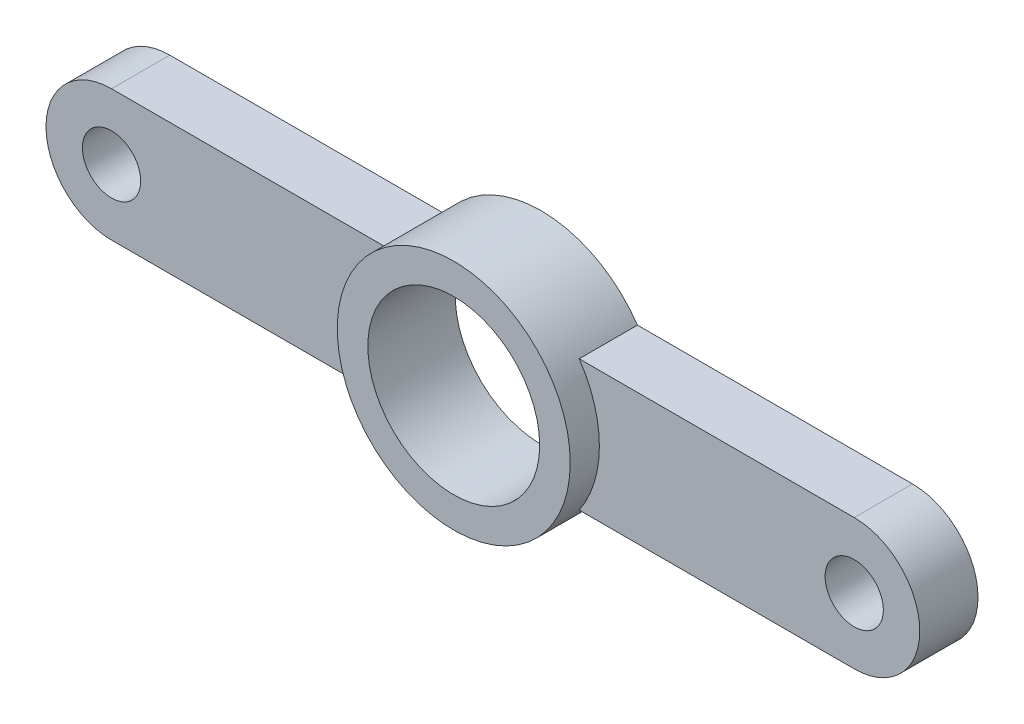
ISO-10303-21;
HEADER;
FILE_DESCRIPTION(('STEP AP214'),'2;1');
FILE_NAME('part.step','',(''),(''),'','','');
FILE_SCHEMA(('AUTOMOTIVE_DESIGN { 1 0 10303 214 1 1 1 1 }'));
ENDSEC;
DATA;
#1=APPLICATION_CONTEXT('core data for automotive mechanical design processes');
#2=APPLICATION_PROTOCOL_DEFINITION('international standard','automotive_design',2000,#1);
#3=PRODUCT_CONTEXT('',#1,'mechanical');
#4=PRODUCT('Part','Part','',(#3));
#5=PRODUCT_RELATED_PRODUCT_CATEGORY('part','',(#4));
#6=PRODUCT_DEFINITION_FORMATION('','',#4);
#7=PRODUCT_DEFINITION_CONTEXT('part definition',#1,'design');
#8=PRODUCT_DEFINITION('design','',#6,#7);
#9=PRODUCT_DEFINITION_SHAPE('','',#8);
#10=(LENGTH_UNIT() NAMED_UNIT(*) SI_UNIT(.MILLI.,.METRE.));
#11=(NAMED_UNIT(*) PLANE_ANGLE_UNIT() SI_UNIT($,.RADIAN.));
#12=(NAMED_UNIT(*) SI_UNIT($,.STERADIAN.) SOLID_ANGLE_UNIT());
#13=UNCERTAINTY_MEASURE_WITH_UNIT(LENGTH_MEASURE(1.E-05),#10,'distance_accuracy_value','');
#14=(GEOMETRIC_REPRESENTATION_CONTEXT(3) GLOBAL_UNCERTAINTY_ASSIGNED_CONTEXT((#13)) GLOBAL_UNIT_ASSIGNED_CONTEXT((#10,
#11,#12)) REPRESENTATION_CONTEXT('',''));
#15=CARTESIAN_POINT('',(0.,0.,0.));
#16=DIRECTION('',(0.,0.,1.));
#17=DIRECTION('',(1.,0.,0.));
#18=AXIS2_PLACEMENT_3D('',#15,#16,#17);
#19=CARTESIAN_POINT('',(0.,0.,3.));
#20=DIRECTION('',(0.,0.,1.));
#21=DIRECTION('',(1.,0.,0.));
#22=AXIS2_PLACEMENT_3D('',#19,#20,#21);
#23=PLANE('',#22);
#24=CARTESIAN_POINT('',(0.,0.,3.));
#25=DIRECTION('',(0.,0.,-1.));
#26=DIRECTION('',(1.,0.,0.));
#27=AXIS2_PLACEMENT_3D('',#24,#25,#26);
#28=CIRCLE('',#27,2.95);
#29=CARTESIAN_POINT('',(2.95,0.,3.));
#30=VERTEX_POINT('',#29);
#31=EDGE_CURVE('E41',#30,#30,#28,.T.);
#32=ORIENTED_EDGE('',*,*,#31,.T.);
#33=EDGE_LOOP('',(#32));
#34=FACE_BOUND('',#33,.T.);
#35=CARTESIAN_POINT('',(0.,0.,3.));
#36=DIRECTION('',(0.,0.,1.));
#37=DIRECTION('',(1.,0.,0.));
#38=AXIS2_PLACEMENT_3D('',#35,#36,#37);
#39=CIRCLE('',#38,4.);
#40=CARTESIAN_POINT('',(4.,0.,3.));
#41=VERTEX_POINT('',#40);
#42=EDGE_CURVE('E225',#41,#41,#39,.T.);
#43=ORIENTED_EDGE('',*,*,#42,.T.);
#44=EDGE_LOOP('',(#43));
#45=FACE_BOUND('',#44,.T.);
#46=ADVANCED_FACE('F16',(#34,#45),#23,.T.);
#47=CARTESIAN_POINT('',(0.,0.,2.));
#48=DIRECTION('',(0.,0.,1.));
#49=DIRECTION('',(1.,0.,0.));
#50=AXIS2_PLACEMENT_3D('',#47,#48,#49);
#51=PLANE('',#50);
#52=CARTESIAN_POINT('',(12.75,0.,2.));
#53=DIRECTION('',(0.,0.,-1.));
#54=DIRECTION('',(1.,0.,0.));
#55=AXIS2_PLACEMENT_3D('',#52,#53,#54);
#56=CIRCLE('',#55,1.);
#57=CARTESIAN_POINT('',(13.75,0.,2.));
#58=VERTEX_POINT('',#57);
#59=EDGE_CURVE('E11',#58,#58,#56,.T.);
#60=ORIENTED_EDGE('',*,*,#59,.T.);
#61=EDGE_LOOP('',(#60));
#62=FACE_BOUND('',#61,.T.);
#63=CARTESIAN_POINT('',(12.75,0.,2.));
#64=DIRECTION('',(0.,0.,-1.));
#65=DIRECTION('',(0.,1.,0.));
#66=AXIS2_PLACEMENT_3D('',#63,#64,#65);
#67=CIRCLE('',#66,2.25);
#68=CARTESIAN_POINT('',(12.75,2.25,2.));
#69=VERTEX_POINT('',#68);
#70=CARTESIAN_POINT('',(12.75,-2.25,2.));
#71=VERTEX_POINT('',#70);
#72=EDGE_CURVE('E252',#69,#71,#67,.T.);
#73=ORIENTED_EDGE('',*,*,#72,.F.);
#74=DIRECTION('',(-1.,0.,0.));
#75=VECTOR('',#74,1.);
#76=CARTESIAN_POINT('',(12.75,2.25,2.));
#77=LINE('',#76,#75);
#78=CARTESIAN_POINT('',(3.307189138831,2.25,2.));
#79=VERTEX_POINT('',#78);
#80=EDGE_CURVE('E254',#69,#79,#77,.T.);
#81=ORIENTED_EDGE('',*,*,#80,.T.);
#82=CARTESIAN_POINT('',(0.,0.,2.));
#83=DIRECTION('',(0.,0.,-1.));
#84=DIRECTION('',(1.,0.,0.));
#85=AXIS2_PLACEMENT_3D('',#82,#83,#84);
#86=CIRCLE('',#85,4.);
#87=CARTESIAN_POINT('',(4.,0.,2.));
#88=VERTEX_POINT('',#87);
#89=EDGE_CURVE('E223',#79,#88,#86,.T.);
#90=ORIENTED_EDGE('',*,*,#89,.T.);
#91=CARTESIAN_POINT('',(0.,0.,2.));
#92=DIRECTION('',(0.,0.,-1.));
#93=DIRECTION('',(1.,0.,0.));
#94=AXIS2_PLACEMENT_3D('',#91,#92,#93);
#95=CIRCLE('',#94,4.);
#96=CARTESIAN_POINT('',(3.307189138831,-2.25,2.));
#97=VERTEX_POINT('',#96);
#98=EDGE_CURVE('E212',#88,#97,#95,.T.);
#99=ORIENTED_EDGE('',*,*,#98,.T.);
#100=DIRECTION('',(1.,0.,0.));
#101=VECTOR('',#100,1.);
#102=CARTESIAN_POINT('',(-12.75,-2.25,2.));
#103=LINE('',#102,#101);
#104=EDGE_CURVE('E243',#97,#71,#103,.T.);
#105=ORIENTED_EDGE('',*,*,#104,.T.);
#106=EDGE_LOOP('',(#73,#81,#90,#99,#105));
#107=FACE_BOUND('',#106,.T.);
#108=ADVANCED_FACE('F18',(#62,#107),#51,.T.);
#109=CARTESIAN_POINT('',(12.75,0.,0.));
#110=DIRECTION('',(0.,0.,-1.));
#111=DIRECTION('',(1.,0.,0.));
#112=AXIS2_PLACEMENT_3D('',#109,#110,#111);
#113=CYLINDRICAL_SURFACE('',#112,1.);
#114=CARTESIAN_POINT('',(12.75,0.,0.));
#115=DIRECTION('',(0.,0.,1.));
#116=DIRECTION('',(1.,0.,0.));
#117=AXIS2_PLACEMENT_3D('',#114,#115,#116);
#118=CIRCLE('',#117,1.);
#119=CARTESIAN_POINT('',(13.75,0.,0.));
#120=VERTEX_POINT('',#119);
#121=EDGE_CURVE('E206',#120,#120,#118,.T.);
#122=ORIENTED_EDGE('',*,*,#121,.F.);
#123=DIRECTION('',(0.,0.,1.));
#124=VECTOR('',#123,1.);
#125=CARTESIAN_POINT('',(13.75,0.,0.));
#126=LINE('',#125,#124);
#127=EDGE_CURVE('E20',#120,#58,#126,.T.);
#128=ORIENTED_EDGE('',*,*,#127,.T.);
#129=ORIENTED_EDGE('',*,*,#59,.F.);
#130=ORIENTED_EDGE('',*,*,#127,.F.);
#131=EDGE_LOOP('',(#122,#128,#129,#130));
#132=FACE_BOUND('',#131,.T.);
#133=ADVANCED_FACE('F275',(#132),#113,.F.);
#134=CARTESIAN_POINT('',(0.,0.,0.));
#135=DIRECTION('',(0.,0.,-1.));
#136=DIRECTION('',(1.,0.,0.));
#137=AXIS2_PLACEMENT_3D('',#134,#135,#136);
#138=CYLINDRICAL_SURFACE('',#137,2.95);
#139=CARTESIAN_POINT('',(0.,0.,0.));
#140=DIRECTION('',(0.,0.,1.));
#141=DIRECTION('',(1.,0.,0.));
#142=AXIS2_PLACEMENT_3D('',#139,#140,#141);
#143=CIRCLE('',#142,2.95);
#144=CARTESIAN_POINT('',(2.95,0.,0.));
#145=VERTEX_POINT('',#144);
#146=EDGE_CURVE('E200',#145,#145,#143,.T.);
#147=ORIENTED_EDGE('',*,*,#146,.F.);
#148=DIRECTION('',(0.,0.,1.));
#149=VECTOR('',#148,1.);
#150=CARTESIAN_POINT('',(2.95,0.,0.));
#151=LINE('',#150,#149);
#152=EDGE_CURVE('E261',#145,#30,#151,.T.);
#153=ORIENTED_EDGE('',*,*,#152,.T.);
#154=ORIENTED_EDGE('',*,*,#31,.F.);
#155=ORIENTED_EDGE('',*,*,#152,.F.);
#156=EDGE_LOOP('',(#147,#153,#154,#155));
#157=FACE_BOUND('',#156,.T.);
#158=ADVANCED_FACE('F314',(#157),#138,.F.);
#159=CARTESIAN_POINT('',(-12.75,0.,0.));
#160=DIRECTION('',(0.,0.,-1.));
#161=DIRECTION('',(1.,0.,0.));
#162=AXIS2_PLACEMENT_3D('',#159,#160,#161);
#163=CYLINDRICAL_SURFACE('',#162,1.);
#164=CARTESIAN_POINT('',(-12.75,0.,0.));
#165=DIRECTION('',(0.,0.,1.));
#166=DIRECTION('',(1.,0.,0.));
#167=AXIS2_PLACEMENT_3D('',#164,#165,#166);
#168=CIRCLE('',#167,1.);
#169=CARTESIAN_POINT('',(-11.75,0.,0.));
#170=VERTEX_POINT('',#169);
#171=EDGE_CURVE('E195',#170,#170,#168,.T.);
#172=ORIENTED_EDGE('',*,*,#171,.F.);
#173=DIRECTION('',(0.,0.,1.));
#174=VECTOR('',#173,1.);
#175=CARTESIAN_POINT('',(-11.75,0.,0.));
#176=LINE('',#175,#174);
#177=CARTESIAN_POINT('',(-11.75,0.,2.));
#178=VERTEX_POINT('',#177);
#179=EDGE_CURVE('E256',#170,#178,#176,.T.);
#180=ORIENTED_EDGE('',*,*,#179,.T.);
#181=CARTESIAN_POINT('',(-12.75,0.,2.));
#182=DIRECTION('',(0.,0.,-1.));
#183=DIRECTION('',(1.,0.,0.));
#184=AXIS2_PLACEMENT_3D('',#181,#182,#183);
#185=CIRCLE('',#184,1.);
#186=EDGE_CURVE('E233',#178,#178,#185,.T.);
#187=ORIENTED_EDGE('',*,*,#186,.F.);
#188=ORIENTED_EDGE('',*,*,#179,.F.);
#189=EDGE_LOOP('',(#172,#180,#187,#188));
#190=FACE_BOUND('',#189,.T.);
#191=ADVANCED_FACE('F319',(#190),#163,.F.);
#192=CARTESIAN_POINT('',(12.75,2.25,0.));
#193=DIRECTION('',(0.,-1.,0.));
#194=DIRECTION('',(0.,0.,-1.));
#195=AXIS2_PLACEMENT_3D('',#192,#193,#194);
#196=PLANE('',#195);
#197=DIRECTION('',(0.,0.,-1.));
#198=VECTOR('',#197,1.);
#199=CARTESIAN_POINT('',(3.307189138831,2.25,0.));
#200=LINE('',#199,#198);
#201=CARTESIAN_POINT('',(3.307189138831,2.25,0.));
#202=VERTEX_POINT('',#201);
#203=EDGE_CURVE('E205',#79,#202,#200,.T.);
#204=ORIENTED_EDGE('',*,*,#203,.F.);
#205=ORIENTED_EDGE('',*,*,#80,.F.);
#206=DIRECTION('',(0.,0.,1.));
#207=VECTOR('',#206,1.);
#208=CARTESIAN_POINT('',(12.75,2.25,0.));
#209=LINE('',#208,#207);
#210=CARTESIAN_POINT('',(12.75,2.25,0.));
#211=VERTEX_POINT('',#210);
#212=EDGE_CURVE('E248',#211,#69,#209,.T.);
#213=ORIENTED_EDGE('',*,*,#212,.F.);
#214=DIRECTION('',(-1.,0.,0.));
#215=VECTOR('',#214,1.);
#216=CARTESIAN_POINT('',(12.75,2.25,0.));
#217=LINE('',#216,#215);
#218=EDGE_CURVE('E179',#211,#202,#217,.T.);
#219=ORIENTED_EDGE('',*,*,#218,.T.);
#220=EDGE_LOOP('',(#204,#205,#213,#219));
#221=FACE_BOUND('',#220,.T.);
#222=ADVANCED_FACE('F294',(#221),#196,.F.);
#223=CARTESIAN_POINT('',(12.75,0.,0.));
#224=DIRECTION('',(0.,0.,-1.));
#225=DIRECTION('',(1.,0.,0.));
#226=AXIS2_PLACEMENT_3D('',#223,#224,#225);
#227=CYLINDRICAL_SURFACE('',#226,2.25);
#228=DIRECTION('',(0.,0.,1.));
#229=VECTOR('',#228,1.);
#230=CARTESIAN_POINT('',(12.75,-2.25,0.));
#231=LINE('',#230,#229);
#232=CARTESIAN_POINT('',(12.75,-2.25,0.));
#233=VERTEX_POINT('',#232);
#234=EDGE_CURVE('E239',#233,#71,#231,.T.);
#235=ORIENTED_EDGE('',*,*,#234,.F.);
#236=CARTESIAN_POINT('',(12.75,0.,0.));
#237=DIRECTION('',(0.,0.,1.));
#238=DIRECTION('',(0.,-1.,0.));
#239=AXIS2_PLACEMENT_3D('',#236,#237,#238);
#240=CIRCLE('',#239,2.25);
#241=EDGE_CURVE('E182',#233,#211,#240,.T.);
#242=ORIENTED_EDGE('',*,*,#241,.T.);
#243=ORIENTED_EDGE('',*,*,#212,.T.);
#244=ORIENTED_EDGE('',*,*,#72,.T.);
#245=EDGE_LOOP('',(#235,#242,#243,#244));
#246=FACE_BOUND('',#245,.T.);
#247=ADVANCED_FACE('F297',(#246),#227,.T.);
#248=CARTESIAN_POINT('',(-12.75,-2.25,0.));
#249=DIRECTION('',(0.,1.,0.));
#250=DIRECTION('',(1.,0.,0.));
#251=AXIS2_PLACEMENT_3D('',#248,#249,#250);
#252=PLANE('',#251);
#253=ORIENTED_EDGE('',*,*,#234,.T.);
#254=ORIENTED_EDGE('',*,*,#104,.F.);
#255=DIRECTION('',(0.,0.,-1.));
#256=VECTOR('',#255,1.);
#257=CARTESIAN_POINT('',(3.307189138831,-2.25,0.));
#258=LINE('',#257,#256);
#259=CARTESIAN_POINT('',(3.307189138831,-2.25,0.));
#260=VERTEX_POINT('',#259);
#261=EDGE_CURVE('E144',#97,#260,#258,.T.);
#262=ORIENTED_EDGE('',*,*,#261,.T.);
#263=DIRECTION('',(1.,0.,0.));
#264=VECTOR('',#263,1.);
#265=CARTESIAN_POINT('',(-12.75,-2.25,0.));
#266=LINE('',#265,#264);
#267=EDGE_CURVE('E187',#260,#233,#266,.T.);
#268=ORIENTED_EDGE('',*,*,#267,.T.);
#269=EDGE_LOOP('',(#253,#254,#262,#268));
#270=FACE_BOUND('',#269,.T.);
#271=ADVANCED_FACE('F299',(#270),#252,.F.);
#272=CARTESIAN_POINT('',(12.75,2.25,0.));
#273=DIRECTION('',(0.,-1.,0.));
#274=DIRECTION('',(0.,0.,-1.));
#275=AXIS2_PLACEMENT_3D('',#272,#273,#274);
#276=PLANE('',#275);
#277=DIRECTION('',(0.,0.,1.));
#278=VECTOR('',#277,1.);
#279=CARTESIAN_POINT('',(-12.75,2.25,0.));
#280=LINE('',#279,#278);
#281=CARTESIAN_POINT('',(-12.75,2.25,0.));
#282=VERTEX_POINT('',#281);
#283=CARTESIAN_POINT('',(-12.75,2.25,2.));
#284=VERTEX_POINT('',#283);
#285=EDGE_CURVE('E236',#282,#284,#280,.T.);
#286=ORIENTED_EDGE('',*,*,#285,.T.);
#287=DIRECTION('',(-1.,0.,0.));
#288=VECTOR('',#287,1.);
#289=CARTESIAN_POINT('',(12.75,2.25,2.));
#290=LINE('',#289,#288);
#291=CARTESIAN_POINT('',(-3.307189138831,2.25,2.));
#292=VERTEX_POINT('',#291);
#293=EDGE_CURVE('E229',#292,#284,#290,.T.);
#294=ORIENTED_EDGE('',*,*,#293,.F.);
#295=DIRECTION('',(0.,0.,-1.));
#296=VECTOR('',#295,1.);
#297=CARTESIAN_POINT('',(-3.307189138831,2.25,0.));
#298=LINE('',#297,#296);
#299=CARTESIAN_POINT('',(-3.307189138831,2.25,0.));
#300=VERTEX_POINT('',#299);
#301=EDGE_CURVE('E143',#292,#300,#298,.T.);
#302=ORIENTED_EDGE('',*,*,#301,.T.);
#303=DIRECTION('',(-1.,0.,0.));
#304=VECTOR('',#303,1.);
#305=CARTESIAN_POINT('',(12.75,2.25,0.));
#306=LINE('',#305,#304);
#307=EDGE_CURVE('E174',#300,#282,#306,.T.);
#308=ORIENTED_EDGE('',*,*,#307,.T.);
#309=EDGE_LOOP('',(#286,#294,#302,#308));
#310=FACE_BOUND('',#309,.T.);
#311=ADVANCED_FACE('F288',(#310),#276,.F.);
#312=CARTESIAN_POINT('',(-12.75,0.,0.));
#313=DIRECTION('',(0.,0.,-1.));
#314=DIRECTION('',(1.,0.,0.));
#315=AXIS2_PLACEMENT_3D('',#312,#313,#314);
#316=CYLINDRICAL_SURFACE('',#315,2.25);
#317=DIRECTION('',(0.,0.,1.));
#318=VECTOR('',#317,1.);
#319=CARTESIAN_POINT('',(-12.75,-2.25,0.));
#320=LINE('',#319,#318);
#321=CARTESIAN_POINT('',(-12.75,-2.25,0.));
#322=VERTEX_POINT('',#321);
#323=CARTESIAN_POINT('',(-12.75,-2.25,2.));
#324=VERTEX_POINT('',#323);
#325=EDGE_CURVE('E156',#322,#324,#320,.T.);
#326=ORIENTED_EDGE('',*,*,#325,.T.);
#327=CARTESIAN_POINT('',(-12.75,0.,2.));
#328=DIRECTION('',(0.,0.,1.));
#329=DIRECTION('',(1.,0.,0.));
#330=AXIS2_PLACEMENT_3D('',#327,#328,#329);
#331=CIRCLE('',#330,2.25);
#332=EDGE_CURVE('E151',#284,#324,#331,.T.);
#333=ORIENTED_EDGE('',*,*,#332,.F.);
#334=ORIENTED_EDGE('',*,*,#285,.F.);
#335=CARTESIAN_POINT('',(-12.75,0.,0.));
#336=DIRECTION('',(0.,0.,1.));
#337=DIRECTION('',(1.,0.,0.));
#338=AXIS2_PLACEMENT_3D('',#335,#336,#337);
#339=CIRCLE('',#338,2.25);
#340=EDGE_CURVE('E170',#282,#322,#339,.T.);
#341=ORIENTED_EDGE('',*,*,#340,.T.);
#342=EDGE_LOOP('',(#326,#333,#334,#341));
#343=FACE_BOUND('',#342,.T.);
#344=ADVANCED_FACE('F286',(#343),#316,.T.);
#345=CARTESIAN_POINT('',(0.,0.,2.));
#346=DIRECTION('',(0.,0.,1.));
#347=DIRECTION('',(1.,0.,0.));
#348=AXIS2_PLACEMENT_3D('',#345,#346,#347);
#349=PLANE('',#348);
#350=ORIENTED_EDGE('',*,*,#186,.T.);
#351=EDGE_LOOP('',(#350));
#352=FACE_BOUND('',#351,.T.);
#353=CARTESIAN_POINT('',(0.,0.,2.));
#354=DIRECTION('',(0.,0.,-1.));
#355=DIRECTION('',(1.,0.,0.));
#356=AXIS2_PLACEMENT_3D('',#353,#354,#355);
#357=CIRCLE('',#356,4.);
#358=CARTESIAN_POINT('',(-3.307189138831,-2.25,2.));
#359=VERTEX_POINT('',#358);
#360=EDGE_CURVE('E133',#359,#292,#357,.T.);
#361=ORIENTED_EDGE('',*,*,#360,.T.);
#362=ORIENTED_EDGE('',*,*,#293,.T.);
#363=ORIENTED_EDGE('',*,*,#332,.T.);
#364=DIRECTION('',(1.,0.,0.));
#365=VECTOR('',#364,1.);
#366=CARTESIAN_POINT('',(-12.75,-2.25,2.));
#367=LINE('',#366,#365);
#368=EDGE_CURVE('E146',#324,#359,#367,.T.);
#369=ORIENTED_EDGE('',*,*,#368,.T.);
#370=EDGE_LOOP('',(#361,#362,#363,#369));
#371=FACE_BOUND('',#370,.T.);
#372=ADVANCED_FACE('F149',(#352,#371),#349,.T.);
#373=CARTESIAN_POINT('',(0.,0.,0.));
#374=DIRECTION('',(0.,0.,-1.));
#375=DIRECTION('',(1.,0.,0.));
#376=AXIS2_PLACEMENT_3D('',#373,#374,#375);
#377=CYLINDRICAL_SURFACE('',#376,4.);
#378=ORIENTED_EDGE('',*,*,#203,.T.);
#379=CARTESIAN_POINT('',(0.,0.,0.));
#380=DIRECTION('',(0.,0.,1.));
#381=DIRECTION('',(1.,0.,0.));
#382=AXIS2_PLACEMENT_3D('',#379,#380,#381);
#383=CIRCLE('',#382,4.);
#384=EDGE_CURVE('E180',#202,#300,#383,.T.);
#385=ORIENTED_EDGE('',*,*,#384,.T.);
#386=ORIENTED_EDGE('',*,*,#301,.F.);
#387=ORIENTED_EDGE('',*,*,#360,.F.);
#388=DIRECTION('',(0.,0.,-1.));
#389=VECTOR('',#388,1.);
#390=CARTESIAN_POINT('',(-3.307189138831,-2.25,0.));
#391=LINE('',#390,#389);
#392=CARTESIAN_POINT('',(-3.307189138831,-2.25,0.));
#393=VERTEX_POINT('',#392);
#394=EDGE_CURVE('E137',#359,#393,#391,.T.);
#395=ORIENTED_EDGE('',*,*,#394,.T.);
#396=CARTESIAN_POINT('',(0.,0.,0.));
#397=DIRECTION('',(0.,0.,1.));
#398=DIRECTION('',(1.,0.,0.));
#399=AXIS2_PLACEMENT_3D('',#396,#397,#398);
#400=CIRCLE('',#399,4.);
#401=EDGE_CURVE('E188',#393,#260,#400,.T.);
#402=ORIENTED_EDGE('',*,*,#401,.T.);
#403=ORIENTED_EDGE('',*,*,#261,.F.);
#404=ORIENTED_EDGE('',*,*,#98,.F.);
#405=DIRECTION('',(0.,0.,1.));
#406=VECTOR('',#405,1.);
#407=CARTESIAN_POINT('',(4.,0.,0.));
#408=LINE('',#407,#406);
#409=EDGE_CURVE('E217',#88,#41,#408,.T.);
#410=ORIENTED_EDGE('',*,*,#409,.T.);
#411=ORIENTED_EDGE('',*,*,#42,.F.);
#412=ORIENTED_EDGE('',*,*,#409,.F.);
#413=ORIENTED_EDGE('',*,*,#89,.F.);
#414=EDGE_LOOP('',(#378,#385,#386,#387,#395,#402,#403,#404,#410,#411,#412,#413));
#415=FACE_BOUND('',#414,.T.);
#416=ADVANCED_FACE('F136',(#415),#377,.T.);
#417=CARTESIAN_POINT('',(0.,0.,0.));
#418=DIRECTION('',(0.,0.,1.));
#419=DIRECTION('',(1.,0.,0.));
#420=AXIS2_PLACEMENT_3D('',#417,#418,#419);
#421=PLANE('',#420);
#422=ORIENTED_EDGE('',*,*,#121,.T.);
#423=EDGE_LOOP('',(#422));
#424=FACE_BOUND('',#423,.T.);
#425=ORIENTED_EDGE('',*,*,#146,.T.);
#426=EDGE_LOOP('',(#425));
#427=FACE_BOUND('',#426,.T.);
#428=ORIENTED_EDGE('',*,*,#171,.T.);
#429=EDGE_LOOP('',(#428));
#430=FACE_BOUND('',#429,.T.);
#431=ORIENTED_EDGE('',*,*,#340,.F.);
#432=ORIENTED_EDGE('',*,*,#307,.F.);
#433=ORIENTED_EDGE('',*,*,#384,.F.);
#434=ORIENTED_EDGE('',*,*,#218,.F.);
#435=ORIENTED_EDGE('',*,*,#241,.F.);
#436=ORIENTED_EDGE('',*,*,#267,.F.);
#437=ORIENTED_EDGE('',*,*,#401,.F.);
#438=DIRECTION('',(1.,0.,0.));
#439=VECTOR('',#438,1.);
#440=CARTESIAN_POINT('',(-12.75,-2.25,0.));
#441=LINE('',#440,#439);
#442=EDGE_CURVE('E161',#322,#393,#441,.T.);
#443=ORIENTED_EDGE('',*,*,#442,.F.);
#444=EDGE_LOOP('',(#431,#432,#433,#434,#435,#436,#437,#443));
#445=FACE_BOUND('',#444,.T.);
#446=ADVANCED_FACE('F273',(#424,#427,#430,#445),#421,.F.);
#447=CARTESIAN_POINT('',(-12.75,-2.25,0.));
#448=DIRECTION('',(0.,1.,0.));
#449=DIRECTION('',(1.,0.,0.));
#450=AXIS2_PLACEMENT_3D('',#447,#448,#449);
#451=PLANE('',#450);
#452=ORIENTED_EDGE('',*,*,#394,.F.);
#453=ORIENTED_EDGE('',*,*,#368,.F.);
#454=ORIENTED_EDGE('',*,*,#325,.F.);
#455=ORIENTED_EDGE('',*,*,#442,.T.);
#456=EDGE_LOOP('',(#452,#453,#454,#455));
#457=FACE_BOUND('',#456,.T.);
#458=ADVANCED_FACE('F157',(#457),#451,.F.);
#459=CLOSED_SHELL('',(#46,#108,#133,#158,#191,#222,#247,#271,#311,#344,#372,#416,#446,#458));
#460=MANIFOLD_SOLID_BREP('B1',#459);
#461=ADVANCED_BREP_SHAPE_REPRESENTATION('',(#18,#460),#14);
#462=SHAPE_DEFINITION_REPRESENTATION(#9,#461);
ENDSEC;
END-ISO-10303-21;
